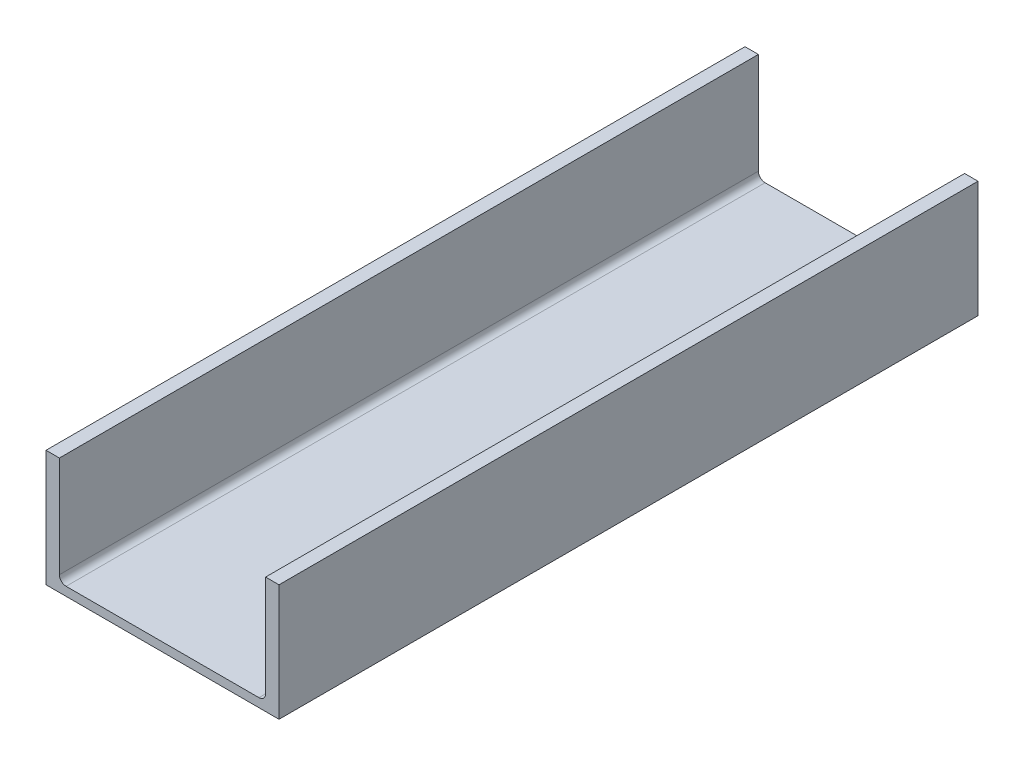
ISO-10303-21;
HEADER;
FILE_DESCRIPTION(('STEP AP214'),'2;1');
FILE_NAME('part.step','',(''),(''),'','','');
FILE_SCHEMA(('AUTOMOTIVE_DESIGN { 1 0 10303 214 1 1 1 1 }'));
ENDSEC;
DATA;
#1=APPLICATION_CONTEXT('core data for automotive mechanical design processes');
#2=APPLICATION_PROTOCOL_DEFINITION('international standard','automotive_design',2000,#1);
#3=PRODUCT_CONTEXT('',#1,'mechanical');
#4=PRODUCT('Part','Part','',(#3));
#5=PRODUCT_RELATED_PRODUCT_CATEGORY('part','',(#4));
#6=PRODUCT_DEFINITION_FORMATION('','',#4);
#7=PRODUCT_DEFINITION_CONTEXT('part definition',#1,'design');
#8=PRODUCT_DEFINITION('design','',#6,#7);
#9=PRODUCT_DEFINITION_SHAPE('','',#8);
#10=(LENGTH_UNIT() NAMED_UNIT(*) SI_UNIT(.MILLI.,.METRE.));
#11=(NAMED_UNIT(*) PLANE_ANGLE_UNIT() SI_UNIT($,.RADIAN.));
#12=(NAMED_UNIT(*) SI_UNIT($,.STERADIAN.) SOLID_ANGLE_UNIT());
#13=UNCERTAINTY_MEASURE_WITH_UNIT(LENGTH_MEASURE(1.E-05),#10,'distance_accuracy_value','');
#14=(GEOMETRIC_REPRESENTATION_CONTEXT(3) GLOBAL_UNCERTAINTY_ASSIGNED_CONTEXT((#13)) GLOBAL_UNIT_ASSIGNED_CONTEXT((#10,
#11,#12)) REPRESENTATION_CONTEXT('',''));
#15=CARTESIAN_POINT('',(0.,0.,0.));
#16=DIRECTION('',(0.,0.,1.));
#17=DIRECTION('',(1.,0.,0.));
#18=AXIS2_PLACEMENT_3D('',#15,#16,#17);
#19=CARTESIAN_POINT('',(-44.958,25.4,152.4));
#20=DIRECTION('',(0.,-1.,0.));
#21=DIRECTION('',(1.,0.,0.));
#22=AXIS2_PLACEMENT_3D('',#19,#20,#21);
#23=PLANE('',#22);
#24=DIRECTION('',(-1.,0.,0.));
#25=VECTOR('',#24,1.);
#26=CARTESIAN_POINT('',(-44.958,25.4,-152.4));
#27=LINE('',#26,#25);
#28=CARTESIAN_POINT('',(-44.958,25.4,-152.4));
#29=VERTEX_POINT('',#28);
#30=CARTESIAN_POINT('',(-50.8,25.4,-152.4));
#31=VERTEX_POINT('',#30);
#32=EDGE_CURVE('E129',#29,#31,#27,.T.);
#33=ORIENTED_EDGE('',*,*,#32,.T.);
#34=DIRECTION('',(0.,0.,-1.));
#35=VECTOR('',#34,1.);
#36=CARTESIAN_POINT('',(-50.8,25.4,152.4));
#37=LINE('',#36,#35);
#38=CARTESIAN_POINT('',(-50.8,25.4,152.4));
#39=VERTEX_POINT('',#38);
#40=EDGE_CURVE('E112',#39,#31,#37,.T.);
#41=ORIENTED_EDGE('',*,*,#40,.F.);
#42=DIRECTION('',(-1.,0.,0.));
#43=VECTOR('',#42,1.);
#44=CARTESIAN_POINT('',(-44.958,25.4,152.4));
#45=LINE('',#44,#43);
#46=CARTESIAN_POINT('',(-44.958,25.4,152.4));
#47=VERTEX_POINT('',#46);
#48=EDGE_CURVE('E118',#47,#39,#45,.T.);
#49=ORIENTED_EDGE('',*,*,#48,.F.);
#50=DIRECTION('',(0.,0.,-1.));
#51=VECTOR('',#50,1.);
#52=CARTESIAN_POINT('',(-44.958,25.4,152.4));
#53=LINE('',#52,#51);
#54=EDGE_CURVE('E161',#47,#29,#53,.T.);
#55=ORIENTED_EDGE('',*,*,#54,.T.);
#56=EDGE_LOOP('',(#33,#41,#49,#55));
#57=FACE_BOUND('',#56,.T.);
#58=ADVANCED_FACE('F32',(#57),#23,.F.);
#59=CARTESIAN_POINT('',(-50.8,25.4,152.4));
#60=DIRECTION('',(1.,0.,0.));
#61=DIRECTION('',(0.,1.,0.));
#62=AXIS2_PLACEMENT_3D('',#59,#60,#61);
#63=PLANE('',#62);
#64=DIRECTION('',(0.,-1.,0.));
#65=VECTOR('',#64,1.);
#66=CARTESIAN_POINT('',(-50.8,25.4,-152.4));
#67=LINE('',#66,#65);
#68=CARTESIAN_POINT('',(-50.8,-25.4,-152.4));
#69=VERTEX_POINT('',#68);
#70=EDGE_CURVE('E171',#31,#69,#67,.T.);
#71=ORIENTED_EDGE('',*,*,#70,.T.);
#72=DIRECTION('',(0.,0.,-1.));
#73=VECTOR('',#72,1.);
#74=CARTESIAN_POINT('',(-50.8,-25.4,152.4));
#75=LINE('',#74,#73);
#76=CARTESIAN_POINT('',(-50.8,-25.4,152.4));
#77=VERTEX_POINT('',#76);
#78=EDGE_CURVE('E115',#77,#69,#75,.T.);
#79=ORIENTED_EDGE('',*,*,#78,.F.);
#80=DIRECTION('',(0.,-1.,0.));
#81=VECTOR('',#80,1.);
#82=CARTESIAN_POINT('',(-50.8,25.4,152.4));
#83=LINE('',#82,#81);
#84=EDGE_CURVE('E108',#39,#77,#83,.T.);
#85=ORIENTED_EDGE('',*,*,#84,.F.);
#86=ORIENTED_EDGE('',*,*,#40,.T.);
#87=EDGE_LOOP('',(#71,#79,#85,#86));
#88=FACE_BOUND('',#87,.T.);
#89=ADVANCED_FACE('F110',(#88),#63,.F.);
#90=CARTESIAN_POINT('',(-50.8,-25.4,152.4));
#91=DIRECTION('',(0.,1.,0.));
#92=DIRECTION('',(-1.,0.,0.));
#93=AXIS2_PLACEMENT_3D('',#90,#91,#92);
#94=PLANE('',#93);
#95=DIRECTION('',(1.,0.,0.));
#96=VECTOR('',#95,1.);
#97=CARTESIAN_POINT('',(-50.8,-25.4,-152.4));
#98=LINE('',#97,#96);
#99=CARTESIAN_POINT('',(50.8,-25.4,-152.4));
#100=VERTEX_POINT('',#99);
#101=EDGE_CURVE('E173',#69,#100,#98,.T.);
#102=ORIENTED_EDGE('',*,*,#101,.T.);
#103=DIRECTION('',(0.,0.,-1.));
#104=VECTOR('',#103,1.);
#105=CARTESIAN_POINT('',(50.8,-25.4,152.4));
#106=LINE('',#105,#104);
#107=CARTESIAN_POINT('',(50.8,-25.4,152.4));
#108=VERTEX_POINT('',#107);
#109=EDGE_CURVE('E134',#108,#100,#106,.T.);
#110=ORIENTED_EDGE('',*,*,#109,.F.);
#111=DIRECTION('',(1.,0.,0.));
#112=VECTOR('',#111,1.);
#113=CARTESIAN_POINT('',(-50.8,-25.4,152.4));
#114=LINE('',#113,#112);
#115=EDGE_CURVE('E117',#77,#108,#114,.T.);
#116=ORIENTED_EDGE('',*,*,#115,.F.);
#117=ORIENTED_EDGE('',*,*,#78,.T.);
#118=EDGE_LOOP('',(#102,#110,#116,#117));
#119=FACE_BOUND('',#118,.T.);
#120=ADVANCED_FACE('F212',(#119),#94,.F.);
#121=CARTESIAN_POINT('',(50.8,-25.4,152.4));
#122=DIRECTION('',(-1.,0.,0.));
#123=DIRECTION('',(0.,0.,1.));
#124=AXIS2_PLACEMENT_3D('',#121,#122,#123);
#125=PLANE('',#124);
#126=DIRECTION('',(0.,1.,0.));
#127=VECTOR('',#126,1.);
#128=CARTESIAN_POINT('',(50.8,-25.4,-152.4));
#129=LINE('',#128,#127);
#130=CARTESIAN_POINT('',(50.8,25.4,-152.4));
#131=VERTEX_POINT('',#130);
#132=EDGE_CURVE('E175',#100,#131,#129,.T.);
#133=ORIENTED_EDGE('',*,*,#132,.T.);
#134=DIRECTION('',(0.,0.,-1.));
#135=VECTOR('',#134,1.);
#136=CARTESIAN_POINT('',(50.8,25.4,152.4));
#137=LINE('',#136,#135);
#138=CARTESIAN_POINT('',(50.8,25.4,152.4));
#139=VERTEX_POINT('',#138);
#140=EDGE_CURVE('E184',#139,#131,#137,.T.);
#141=ORIENTED_EDGE('',*,*,#140,.F.);
#142=DIRECTION('',(0.,1.,0.));
#143=VECTOR('',#142,1.);
#144=CARTESIAN_POINT('',(50.8,-25.4,152.4));
#145=LINE('',#144,#143);
#146=EDGE_CURVE('E193',#108,#139,#145,.T.);
#147=ORIENTED_EDGE('',*,*,#146,.F.);
#148=ORIENTED_EDGE('',*,*,#109,.T.);
#149=EDGE_LOOP('',(#133,#141,#147,#148));
#150=FACE_BOUND('',#149,.T.);
#151=ADVANCED_FACE('F191',(#150),#125,.F.);
#152=CARTESIAN_POINT('',(50.8,25.4,152.4));
#153=DIRECTION('',(0.,-1.,0.));
#154=DIRECTION('',(1.,0.,0.));
#155=AXIS2_PLACEMENT_3D('',#152,#153,#154);
#156=PLANE('',#155);
#157=DIRECTION('',(-1.,0.,0.));
#158=VECTOR('',#157,1.);
#159=CARTESIAN_POINT('',(50.8,25.4,-152.4));
#160=LINE('',#159,#158);
#161=CARTESIAN_POINT('',(44.958,25.4,-152.4));
#162=VERTEX_POINT('',#161);
#163=EDGE_CURVE('E177',#131,#162,#160,.T.);
#164=ORIENTED_EDGE('',*,*,#163,.T.);
#165=DIRECTION('',(0.,0.,-1.));
#166=VECTOR('',#165,1.);
#167=CARTESIAN_POINT('',(44.958,25.4,152.4));
#168=LINE('',#167,#166);
#169=CARTESIAN_POINT('',(44.958,25.4,152.4));
#170=VERTEX_POINT('',#169);
#171=EDGE_CURVE('E164',#170,#162,#168,.T.);
#172=ORIENTED_EDGE('',*,*,#171,.F.);
#173=DIRECTION('',(-1.,0.,0.));
#174=VECTOR('',#173,1.);
#175=CARTESIAN_POINT('',(50.8,25.4,152.4));
#176=LINE('',#175,#174);
#177=EDGE_CURVE('E208',#139,#170,#176,.T.);
#178=ORIENTED_EDGE('',*,*,#177,.F.);
#179=ORIENTED_EDGE('',*,*,#140,.T.);
#180=EDGE_LOOP('',(#164,#172,#178,#179));
#181=FACE_BOUND('',#180,.T.);
#182=ADVANCED_FACE('F200',(#181),#156,.F.);
#183=CARTESIAN_POINT('',(44.958,25.4,152.4));
#184=DIRECTION('',(1.,0.,0.));
#185=DIRECTION('',(0.,1.,0.));
#186=AXIS2_PLACEMENT_3D('',#183,#184,#185);
#187=PLANE('',#186);
#188=DIRECTION('',(0.,-1.,0.));
#189=VECTOR('',#188,1.);
#190=CARTESIAN_POINT('',(44.958,25.4,-152.4));
#191=LINE('',#190,#189);
#192=CARTESIAN_POINT('',(44.958,-18.669,-152.4));
#193=VERTEX_POINT('',#192);
#194=EDGE_CURVE('E157',#162,#193,#191,.T.);
#195=ORIENTED_EDGE('',*,*,#194,.T.);
#196=DIRECTION('',(0.,0.,-1.));
#197=VECTOR('',#196,1.);
#198=CARTESIAN_POINT('',(44.958,-18.669,152.4));
#199=LINE('',#198,#197);
#200=CARTESIAN_POINT('',(44.958,-18.669,152.4));
#201=VERTEX_POINT('',#200);
#202=EDGE_CURVE('E140',#193,#201,#199,.F.);
#203=ORIENTED_EDGE('',*,*,#202,.T.);
#204=DIRECTION('',(0.,-1.,0.));
#205=VECTOR('',#204,1.);
#206=CARTESIAN_POINT('',(44.958,25.4,152.4));
#207=LINE('',#206,#205);
#208=EDGE_CURVE('E166',#170,#201,#207,.T.);
#209=ORIENTED_EDGE('',*,*,#208,.F.);
#210=ORIENTED_EDGE('',*,*,#171,.T.);
#211=EDGE_LOOP('',(#195,#203,#209,#210));
#212=FACE_BOUND('',#211,.T.);
#213=ADVANCED_FACE('F204',(#212),#187,.F.);
#214=CARTESIAN_POINT('',(44.958,-21.59,152.4));
#215=DIRECTION('',(0.,-1.,0.));
#216=DIRECTION('',(1.,0.,0.));
#217=AXIS2_PLACEMENT_3D('',#214,#215,#216);
#218=PLANE('',#217);
#219=DIRECTION('',(-1.,0.,0.));
#220=VECTOR('',#219,1.);
#221=CARTESIAN_POINT('',(44.958,-21.59,152.4));
#222=LINE('',#221,#220);
#223=CARTESIAN_POINT('',(42.037,-21.59,152.4));
#224=VERTEX_POINT('',#223);
#225=CARTESIAN_POINT('',(-42.037,-21.59,152.4));
#226=VERTEX_POINT('',#225);
#227=EDGE_CURVE('E162',#224,#226,#222,.T.);
#228=ORIENTED_EDGE('',*,*,#227,.F.);
#229=DIRECTION('',(0.,0.,-1.));
#230=VECTOR('',#229,1.);
#231=CARTESIAN_POINT('',(42.037,-21.59,-152.4));
#232=LINE('',#231,#230);
#233=CARTESIAN_POINT('',(42.037,-21.59,-152.4));
#234=VERTEX_POINT('',#233);
#235=EDGE_CURVE('E132',#224,#234,#232,.T.);
#236=ORIENTED_EDGE('',*,*,#235,.T.);
#237=DIRECTION('',(-1.,0.,0.));
#238=VECTOR('',#237,1.);
#239=CARTESIAN_POINT('',(44.958,-21.59,-152.4));
#240=LINE('',#239,#238);
#241=CARTESIAN_POINT('',(-42.037,-21.59,-152.4));
#242=VERTEX_POINT('',#241);
#243=EDGE_CURVE('E152',#234,#242,#240,.T.);
#244=ORIENTED_EDGE('',*,*,#243,.T.);
#245=DIRECTION('',(0.,0.,-1.));
#246=VECTOR('',#245,1.);
#247=CARTESIAN_POINT('',(-42.037,-21.59,152.4));
#248=LINE('',#247,#246);
#249=EDGE_CURVE('E130',#242,#226,#248,.F.);
#250=ORIENTED_EDGE('',*,*,#249,.T.);
#251=EDGE_LOOP('',(#228,#236,#244,#250));
#252=FACE_BOUND('',#251,.T.);
#253=ADVANCED_FACE('F155',(#252),#218,.F.);
#254=CARTESIAN_POINT('',(-44.958,-21.59,152.4));
#255=DIRECTION('',(-1.,0.,0.));
#256=DIRECTION('',(0.,-1.,0.));
#257=AXIS2_PLACEMENT_3D('',#254,#255,#256);
#258=PLANE('',#257);
#259=DIRECTION('',(0.,1.,0.));
#260=VECTOR('',#259,1.);
#261=CARTESIAN_POINT('',(-44.958,-21.59,152.4));
#262=LINE('',#261,#260);
#263=CARTESIAN_POINT('',(-44.958,-18.669,152.4));
#264=VERTEX_POINT('',#263);
#265=EDGE_CURVE('E122',#264,#47,#262,.T.);
#266=ORIENTED_EDGE('',*,*,#265,.F.);
#267=DIRECTION('',(0.,0.,-1.));
#268=VECTOR('',#267,1.);
#269=CARTESIAN_POINT('',(-44.958,-18.669,-152.4));
#270=LINE('',#269,#268);
#271=CARTESIAN_POINT('',(-44.958,-18.669,-152.4));
#272=VERTEX_POINT('',#271);
#273=EDGE_CURVE('E142',#264,#272,#270,.T.);
#274=ORIENTED_EDGE('',*,*,#273,.T.);
#275=DIRECTION('',(0.,1.,0.));
#276=VECTOR('',#275,1.);
#277=CARTESIAN_POINT('',(-44.958,-21.59,-152.4));
#278=LINE('',#277,#276);
#279=EDGE_CURVE('E126',#272,#29,#278,.T.);
#280=ORIENTED_EDGE('',*,*,#279,.T.);
#281=ORIENTED_EDGE('',*,*,#54,.F.);
#282=EDGE_LOOP('',(#266,#274,#280,#281));
#283=FACE_BOUND('',#282,.T.);
#284=ADVANCED_FACE('F160',(#283),#258,.F.);
#285=CARTESIAN_POINT('',(0.,0.,152.4));
#286=DIRECTION('',(0.,0.,1.));
#287=DIRECTION('',(1.,0.,0.));
#288=AXIS2_PLACEMENT_3D('',#285,#286,#287);
#289=PLANE('',#288);
#290=ORIENTED_EDGE('',*,*,#48,.T.);
#291=ORIENTED_EDGE('',*,*,#84,.T.);
#292=ORIENTED_EDGE('',*,*,#115,.T.);
#293=ORIENTED_EDGE('',*,*,#146,.T.);
#294=ORIENTED_EDGE('',*,*,#177,.T.);
#295=ORIENTED_EDGE('',*,*,#208,.T.);
#296=CARTESIAN_POINT('',(42.037,-18.669,152.4));
#297=DIRECTION('',(0.,0.,1.));
#298=DIRECTION('',(1.,0.,0.));
#299=AXIS2_PLACEMENT_3D('',#296,#297,#298);
#300=CIRCLE('',#299,2.921);
#301=EDGE_CURVE('E146',#201,#224,#300,.F.);
#302=ORIENTED_EDGE('',*,*,#301,.T.);
#303=ORIENTED_EDGE('',*,*,#227,.T.);
#304=CARTESIAN_POINT('',(-42.037,-18.669,152.4));
#305=DIRECTION('',(0.,0.,1.));
#306=DIRECTION('',(1.,0.,0.));
#307=AXIS2_PLACEMENT_3D('',#304,#305,#306);
#308=CIRCLE('',#307,2.921);
#309=EDGE_CURVE('E11',#226,#264,#308,.F.);
#310=ORIENTED_EDGE('',*,*,#309,.T.);
#311=ORIENTED_EDGE('',*,*,#265,.T.);
#312=EDGE_LOOP('',(#290,#291,#292,#293,#294,#295,#302,#303,#310,#311));
#313=FACE_BOUND('',#312,.T.);
#314=ADVANCED_FACE('F121',(#313),#289,.T.);
#315=CARTESIAN_POINT('',(0.,0.,-152.4));
#316=DIRECTION('',(0.,0.,1.));
#317=DIRECTION('',(1.,0.,0.));
#318=AXIS2_PLACEMENT_3D('',#315,#316,#317);
#319=PLANE('',#318);
#320=ORIENTED_EDGE('',*,*,#32,.F.);
#321=ORIENTED_EDGE('',*,*,#279,.F.);
#322=CARTESIAN_POINT('',(-42.037,-18.669,-152.4));
#323=DIRECTION('',(0.,0.,1.));
#324=DIRECTION('',(1.,0.,0.));
#325=AXIS2_PLACEMENT_3D('',#322,#323,#324);
#326=CIRCLE('',#325,2.921);
#327=EDGE_CURVE('E40',#272,#242,#326,.T.);
#328=ORIENTED_EDGE('',*,*,#327,.T.);
#329=ORIENTED_EDGE('',*,*,#243,.F.);
#330=CARTESIAN_POINT('',(42.037,-18.669,-152.4));
#331=DIRECTION('',(0.,0.,1.));
#332=DIRECTION('',(1.,0.,0.));
#333=AXIS2_PLACEMENT_3D('',#330,#331,#332);
#334=CIRCLE('',#333,2.921);
#335=EDGE_CURVE('E144',#234,#193,#334,.T.);
#336=ORIENTED_EDGE('',*,*,#335,.T.);
#337=ORIENTED_EDGE('',*,*,#194,.F.);
#338=ORIENTED_EDGE('',*,*,#163,.F.);
#339=ORIENTED_EDGE('',*,*,#132,.F.);
#340=ORIENTED_EDGE('',*,*,#101,.F.);
#341=ORIENTED_EDGE('',*,*,#70,.F.);
#342=EDGE_LOOP('',(#320,#321,#328,#329,#336,#337,#338,#339,#340,#341));
#343=FACE_BOUND('',#342,.T.);
#344=ADVANCED_FACE('F151',(#343),#319,.F.);
#345=CARTESIAN_POINT('',(42.037,-18.669,152.4));
#346=DIRECTION('',(0.,0.,1.));
#347=DIRECTION('',(1.,0.,0.));
#348=AXIS2_PLACEMENT_3D('',#345,#346,#347);
#349=CYLINDRICAL_SURFACE('',#348,2.921);
#350=ORIENTED_EDGE('',*,*,#301,.F.);
#351=ORIENTED_EDGE('',*,*,#202,.F.);
#352=ORIENTED_EDGE('',*,*,#335,.F.);
#353=ORIENTED_EDGE('',*,*,#235,.F.);
#354=EDGE_LOOP('',(#350,#351,#352,#353));
#355=FACE_BOUND('',#354,.T.);
#356=ADVANCED_FACE('F225',(#355),#349,.F.);
#357=CARTESIAN_POINT('',(-42.037,-18.669,152.4));
#358=DIRECTION('',(0.,0.,1.));
#359=DIRECTION('',(1.,0.,0.));
#360=AXIS2_PLACEMENT_3D('',#357,#358,#359);
#361=CYLINDRICAL_SURFACE('',#360,2.921);
#362=ORIENTED_EDGE('',*,*,#309,.F.);
#363=ORIENTED_EDGE('',*,*,#249,.F.);
#364=ORIENTED_EDGE('',*,*,#327,.F.);
#365=ORIENTED_EDGE('',*,*,#273,.F.);
#366=EDGE_LOOP('',(#362,#363,#364,#365));
#367=FACE_BOUND('',#366,.T.);
#368=ADVANCED_FACE('F34',(#367),#361,.F.);
#369=CLOSED_SHELL('',(#58,#89,#120,#151,#182,#213,#253,#284,#314,#344,#356,#368));
#370=MANIFOLD_SOLID_BREP('B2',#369);
#371=ADVANCED_BREP_SHAPE_REPRESENTATION('',(#18,#370),#14);
#372=SHAPE_DEFINITION_REPRESENTATION(#9,#371);
ENDSEC;
END-ISO-10303-21;
